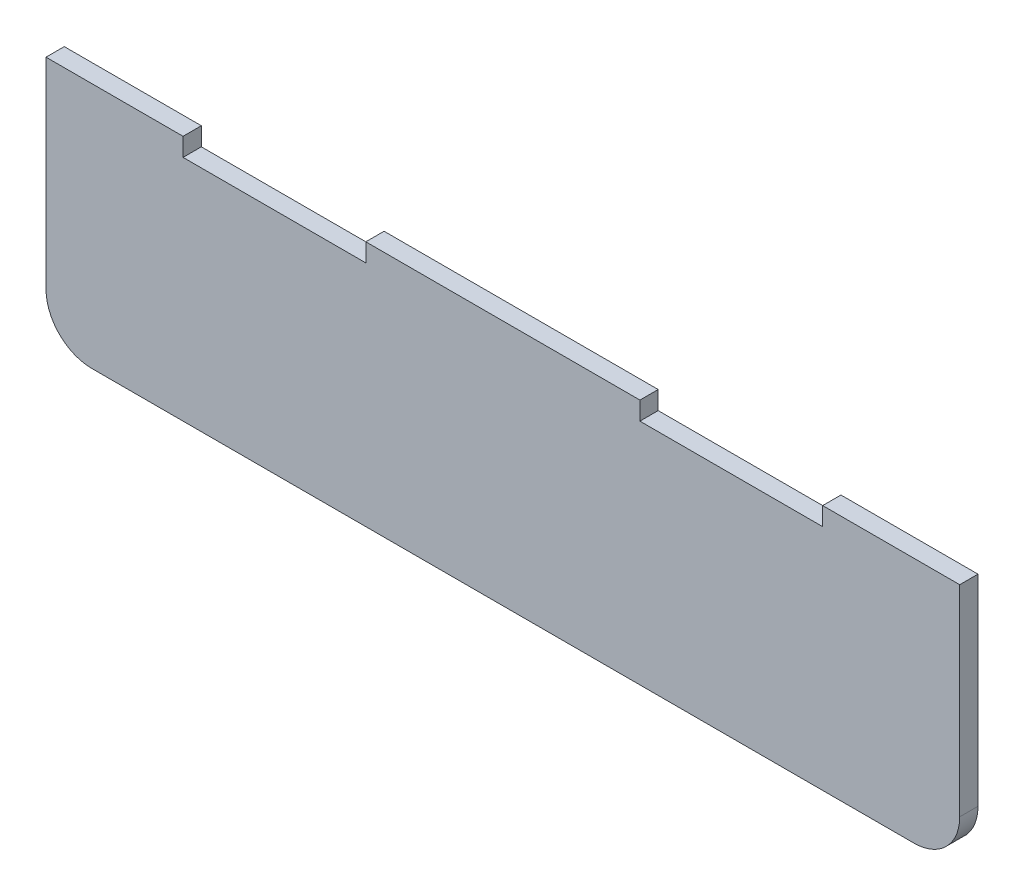
ISO-10303-21;
HEADER;
FILE_DESCRIPTION(('STEP AP214'),'2;1');
FILE_NAME('part.step','',(''),(''),'','','');
FILE_SCHEMA(('AUTOMOTIVE_DESIGN { 1 0 10303 214 1 1 1 1 }'));
ENDSEC;
DATA;
#1=APPLICATION_CONTEXT('core data for automotive mechanical design processes');
#2=APPLICATION_PROTOCOL_DEFINITION('international standard','automotive_design',2000,#1);
#3=PRODUCT_CONTEXT('',#1,'mechanical');
#4=PRODUCT('Part','Part','',(#3));
#5=PRODUCT_RELATED_PRODUCT_CATEGORY('part','',(#4));
#6=PRODUCT_DEFINITION_FORMATION('','',#4);
#7=PRODUCT_DEFINITION_CONTEXT('part definition',#1,'design');
#8=PRODUCT_DEFINITION('design','',#6,#7);
#9=PRODUCT_DEFINITION_SHAPE('','',#8);
#10=(LENGTH_UNIT() NAMED_UNIT(*) SI_UNIT(.MILLI.,.METRE.));
#11=(NAMED_UNIT(*) PLANE_ANGLE_UNIT() SI_UNIT($,.RADIAN.));
#12=(NAMED_UNIT(*) SI_UNIT($,.STERADIAN.) SOLID_ANGLE_UNIT());
#13=UNCERTAINTY_MEASURE_WITH_UNIT(LENGTH_MEASURE(1.E-05),#10,'distance_accuracy_value','');
#14=(GEOMETRIC_REPRESENTATION_CONTEXT(3) GLOBAL_UNCERTAINTY_ASSIGNED_CONTEXT((#13)) GLOBAL_UNIT_ASSIGNED_CONTEXT((#10,
#11,#12)) REPRESENTATION_CONTEXT('',''));
#15=CARTESIAN_POINT('',(0.,0.,0.));
#16=DIRECTION('',(0.,0.,1.));
#17=DIRECTION('',(1.,0.,0.));
#18=AXIS2_PLACEMENT_3D('',#15,#16,#17);
#19=CARTESIAN_POINT('',(200.,54.,4.));
#20=DIRECTION('',(0.,-1.,0.));
#21=DIRECTION('',(1.,0.,0.));
#22=AXIS2_PLACEMENT_3D('',#19,#20,#21);
#23=PLANE('',#22);
#24=DIRECTION('',(-1.,0.,0.));
#25=VECTOR('',#24,1.);
#26=CARTESIAN_POINT('',(200.,54.,0.));
#27=LINE('',#26,#25);
#28=CARTESIAN_POINT('',(200.,54.,0.));
#29=VERTEX_POINT('',#28);
#30=CARTESIAN_POINT('',(170.,54.,0.));
#31=VERTEX_POINT('',#30);
#32=EDGE_CURVE('E169',#29,#31,#27,.T.);
#33=ORIENTED_EDGE('',*,*,#32,.T.);
#34=DIRECTION('',(0.,0.,-1.));
#35=VECTOR('',#34,1.);
#36=CARTESIAN_POINT('',(170.,54.,4.));
#37=LINE('',#36,#35);
#38=CARTESIAN_POINT('',(170.,54.,4.));
#39=VERTEX_POINT('',#38);
#40=EDGE_CURVE('E41',#39,#31,#37,.T.);
#41=ORIENTED_EDGE('',*,*,#40,.F.);
#42=DIRECTION('',(-1.,0.,0.));
#43=VECTOR('',#42,1.);
#44=CARTESIAN_POINT('',(200.,54.,4.));
#45=LINE('',#44,#43);
#46=CARTESIAN_POINT('',(200.,54.,4.));
#47=VERTEX_POINT('',#46);
#48=EDGE_CURVE('E111',#47,#39,#45,.T.);
#49=ORIENTED_EDGE('',*,*,#48,.F.);
#50=DIRECTION('',(0.,0.,-1.));
#51=VECTOR('',#50,1.);
#52=CARTESIAN_POINT('',(200.,54.,4.));
#53=LINE('',#52,#51);
#54=EDGE_CURVE('E11',#47,#29,#53,.T.);
#55=ORIENTED_EDGE('',*,*,#54,.T.);
#56=EDGE_LOOP('',(#33,#41,#49,#55));
#57=FACE_BOUND('',#56,.T.);
#58=ADVANCED_FACE('F33',(#57),#23,.F.);
#59=CARTESIAN_POINT('',(170.,50.,4.));
#60=DIRECTION('',(1.,0.,0.));
#61=DIRECTION('',(0.,0.,-1.));
#62=AXIS2_PLACEMENT_3D('',#59,#60,#61);
#63=PLANE('',#62);
#64=DIRECTION('',(0.,-1.,0.));
#65=VECTOR('',#64,1.);
#66=CARTESIAN_POINT('',(170.,50.,0.));
#67=LINE('',#66,#65);
#68=CARTESIAN_POINT('',(170.,50.,0.));
#69=VERTEX_POINT('',#68);
#70=EDGE_CURVE('E171',#31,#69,#67,.T.);
#71=ORIENTED_EDGE('',*,*,#70,.T.);
#72=DIRECTION('',(0.,0.,-1.));
#73=VECTOR('',#72,1.);
#74=CARTESIAN_POINT('',(170.,50.,4.));
#75=LINE('',#74,#73);
#76=CARTESIAN_POINT('',(170.,50.,4.));
#77=VERTEX_POINT('',#76);
#78=EDGE_CURVE('E219',#77,#69,#75,.T.);
#79=ORIENTED_EDGE('',*,*,#78,.F.);
#80=DIRECTION('',(0.,-1.,0.));
#81=VECTOR('',#80,1.);
#82=CARTESIAN_POINT('',(170.,50.,4.));
#83=LINE('',#82,#81);
#84=EDGE_CURVE('E227',#39,#77,#83,.T.);
#85=ORIENTED_EDGE('',*,*,#84,.F.);
#86=ORIENTED_EDGE('',*,*,#40,.T.);
#87=EDGE_LOOP('',(#71,#79,#85,#86));
#88=FACE_BOUND('',#87,.T.);
#89=ADVANCED_FACE('F225',(#88),#63,.F.);
#90=CARTESIAN_POINT('',(130.,50.,4.));
#91=DIRECTION('',(0.,-1.,0.));
#92=DIRECTION('',(1.,0.,0.));
#93=AXIS2_PLACEMENT_3D('',#90,#91,#92);
#94=PLANE('',#93);
#95=DIRECTION('',(-1.,0.,0.));
#96=VECTOR('',#95,1.);
#97=CARTESIAN_POINT('',(130.,50.,0.));
#98=LINE('',#97,#96);
#99=CARTESIAN_POINT('',(130.,50.,0.));
#100=VERTEX_POINT('',#99);
#101=EDGE_CURVE('E173',#69,#100,#98,.T.);
#102=ORIENTED_EDGE('',*,*,#101,.T.);
#103=DIRECTION('',(0.,0.,-1.));
#104=VECTOR('',#103,1.);
#105=CARTESIAN_POINT('',(130.,50.,4.));
#106=LINE('',#105,#104);
#107=CARTESIAN_POINT('',(130.,50.,4.));
#108=VERTEX_POINT('',#107);
#109=EDGE_CURVE('E216',#108,#100,#106,.T.);
#110=ORIENTED_EDGE('',*,*,#109,.F.);
#111=DIRECTION('',(-1.,0.,0.));
#112=VECTOR('',#111,1.);
#113=CARTESIAN_POINT('',(130.,50.,4.));
#114=LINE('',#113,#112);
#115=EDGE_CURVE('E246',#77,#108,#114,.T.);
#116=ORIENTED_EDGE('',*,*,#115,.F.);
#117=ORIENTED_EDGE('',*,*,#78,.T.);
#118=EDGE_LOOP('',(#102,#110,#116,#117));
#119=FACE_BOUND('',#118,.T.);
#120=ADVANCED_FACE('F237',(#119),#94,.F.);
#121=CARTESIAN_POINT('',(130.,50.,4.));
#122=DIRECTION('',(-1.,0.,0.));
#123=DIRECTION('',(0.,0.,1.));
#124=AXIS2_PLACEMENT_3D('',#121,#122,#123);
#125=PLANE('',#124);
#126=DIRECTION('',(0.,1.,0.));
#127=VECTOR('',#126,1.);
#128=CARTESIAN_POINT('',(130.,50.,0.));
#129=LINE('',#128,#127);
#130=CARTESIAN_POINT('',(130.,54.,0.));
#131=VERTEX_POINT('',#130);
#132=EDGE_CURVE('E175',#100,#131,#129,.T.);
#133=ORIENTED_EDGE('',*,*,#132,.T.);
#134=DIRECTION('',(0.,0.,-1.));
#135=VECTOR('',#134,1.);
#136=CARTESIAN_POINT('',(130.,54.,4.));
#137=LINE('',#136,#135);
#138=CARTESIAN_POINT('',(130.,54.,4.));
#139=VERTEX_POINT('',#138);
#140=EDGE_CURVE('E213',#139,#131,#137,.T.);
#141=ORIENTED_EDGE('',*,*,#140,.F.);
#142=DIRECTION('',(0.,1.,0.));
#143=VECTOR('',#142,1.);
#144=CARTESIAN_POINT('',(130.,50.,4.));
#145=LINE('',#144,#143);
#146=EDGE_CURVE('E243',#108,#139,#145,.T.);
#147=ORIENTED_EDGE('',*,*,#146,.F.);
#148=ORIENTED_EDGE('',*,*,#109,.T.);
#149=EDGE_LOOP('',(#133,#141,#147,#148));
#150=FACE_BOUND('',#149,.T.);
#151=ADVANCED_FACE('F241',(#150),#125,.F.);
#152=CARTESIAN_POINT('',(70.,54.,4.));
#153=DIRECTION('',(0.,-1.,0.));
#154=DIRECTION('',(0.,0.,-1.));
#155=AXIS2_PLACEMENT_3D('',#152,#153,#154);
#156=PLANE('',#155);
#157=DIRECTION('',(-1.,0.,0.));
#158=VECTOR('',#157,1.);
#159=CARTESIAN_POINT('',(70.,54.,0.));
#160=LINE('',#159,#158);
#161=CARTESIAN_POINT('',(70.,54.,0.));
#162=VERTEX_POINT('',#161);
#163=EDGE_CURVE('E177',#131,#162,#160,.T.);
#164=ORIENTED_EDGE('',*,*,#163,.T.);
#165=DIRECTION('',(0.,0.,-1.));
#166=VECTOR('',#165,1.);
#167=CARTESIAN_POINT('',(70.,54.,4.));
#168=LINE('',#167,#166);
#169=CARTESIAN_POINT('',(70.,54.,4.));
#170=VERTEX_POINT('',#169);
#171=EDGE_CURVE('E210',#170,#162,#168,.T.);
#172=ORIENTED_EDGE('',*,*,#171,.F.);
#173=DIRECTION('',(-1.,0.,0.));
#174=VECTOR('',#173,1.);
#175=CARTESIAN_POINT('',(70.,54.,4.));
#176=LINE('',#175,#174);
#177=EDGE_CURVE('E245',#139,#170,#176,.T.);
#178=ORIENTED_EDGE('',*,*,#177,.F.);
#179=ORIENTED_EDGE('',*,*,#140,.T.);
#180=EDGE_LOOP('',(#164,#172,#178,#179));
#181=FACE_BOUND('',#180,.T.);
#182=ADVANCED_FACE('F291',(#181),#156,.F.);
#183=CARTESIAN_POINT('',(70.,50.,4.));
#184=DIRECTION('',(1.,0.,0.));
#185=DIRECTION('',(0.,0.,-1.));
#186=AXIS2_PLACEMENT_3D('',#183,#184,#185);
#187=PLANE('',#186);
#188=DIRECTION('',(0.,-1.,0.));
#189=VECTOR('',#188,1.);
#190=CARTESIAN_POINT('',(70.,50.,0.));
#191=LINE('',#190,#189);
#192=CARTESIAN_POINT('',(70.,50.,0.));
#193=VERTEX_POINT('',#192);
#194=EDGE_CURVE('E179',#162,#193,#191,.T.);
#195=ORIENTED_EDGE('',*,*,#194,.T.);
#196=DIRECTION('',(0.,0.,-1.));
#197=VECTOR('',#196,1.);
#198=CARTESIAN_POINT('',(70.,50.,4.));
#199=LINE('',#198,#197);
#200=CARTESIAN_POINT('',(70.,50.,4.));
#201=VERTEX_POINT('',#200);
#202=EDGE_CURVE('E207',#201,#193,#199,.T.);
#203=ORIENTED_EDGE('',*,*,#202,.F.);
#204=DIRECTION('',(0.,-1.,0.));
#205=VECTOR('',#204,1.);
#206=CARTESIAN_POINT('',(70.,50.,4.));
#207=LINE('',#206,#205);
#208=EDGE_CURVE('E248',#170,#201,#207,.T.);
#209=ORIENTED_EDGE('',*,*,#208,.F.);
#210=ORIENTED_EDGE('',*,*,#171,.T.);
#211=EDGE_LOOP('',(#195,#203,#209,#210));
#212=FACE_BOUND('',#211,.T.);
#213=ADVANCED_FACE('F294',(#212),#187,.F.);
#214=CARTESIAN_POINT('',(30.,50.,4.));
#215=DIRECTION('',(0.,-1.,0.));
#216=DIRECTION('',(0.,0.,-1.));
#217=AXIS2_PLACEMENT_3D('',#214,#215,#216);
#218=PLANE('',#217);
#219=DIRECTION('',(-1.,0.,0.));
#220=VECTOR('',#219,1.);
#221=CARTESIAN_POINT('',(30.,50.,0.));
#222=LINE('',#221,#220);
#223=CARTESIAN_POINT('',(30.,50.,0.));
#224=VERTEX_POINT('',#223);
#225=EDGE_CURVE('E181',#193,#224,#222,.T.);
#226=ORIENTED_EDGE('',*,*,#225,.T.);
#227=DIRECTION('',(0.,0.,-1.));
#228=VECTOR('',#227,1.);
#229=CARTESIAN_POINT('',(30.,50.,4.));
#230=LINE('',#229,#228);
#231=CARTESIAN_POINT('',(30.,50.,4.));
#232=VERTEX_POINT('',#231);
#233=EDGE_CURVE('E204',#232,#224,#230,.T.);
#234=ORIENTED_EDGE('',*,*,#233,.F.);
#235=DIRECTION('',(-1.,0.,0.));
#236=VECTOR('',#235,1.);
#237=CARTESIAN_POINT('',(30.,50.,4.));
#238=LINE('',#237,#236);
#239=EDGE_CURVE('E254',#201,#232,#238,.T.);
#240=ORIENTED_EDGE('',*,*,#239,.F.);
#241=ORIENTED_EDGE('',*,*,#202,.T.);
#242=EDGE_LOOP('',(#226,#234,#240,#241));
#243=FACE_BOUND('',#242,.T.);
#244=ADVANCED_FACE('F298',(#243),#218,.F.);
#245=CARTESIAN_POINT('',(30.,50.,4.));
#246=DIRECTION('',(-1.,0.,0.));
#247=DIRECTION('',(0.,0.,1.));
#248=AXIS2_PLACEMENT_3D('',#245,#246,#247);
#249=PLANE('',#248);
#250=DIRECTION('',(0.,1.,0.));
#251=VECTOR('',#250,1.);
#252=CARTESIAN_POINT('',(30.,50.,0.));
#253=LINE('',#252,#251);
#254=CARTESIAN_POINT('',(30.,54.,0.));
#255=VERTEX_POINT('',#254);
#256=EDGE_CURVE('E183',#224,#255,#253,.T.);
#257=ORIENTED_EDGE('',*,*,#256,.T.);
#258=DIRECTION('',(0.,0.,-1.));
#259=VECTOR('',#258,1.);
#260=CARTESIAN_POINT('',(30.,54.,4.));
#261=LINE('',#260,#259);
#262=CARTESIAN_POINT('',(30.,54.,4.));
#263=VERTEX_POINT('',#262);
#264=EDGE_CURVE('E201',#263,#255,#261,.T.);
#265=ORIENTED_EDGE('',*,*,#264,.F.);
#266=DIRECTION('',(0.,1.,0.));
#267=VECTOR('',#266,1.);
#268=CARTESIAN_POINT('',(30.,50.,4.));
#269=LINE('',#268,#267);
#270=EDGE_CURVE('E256',#232,#263,#269,.T.);
#271=ORIENTED_EDGE('',*,*,#270,.F.);
#272=ORIENTED_EDGE('',*,*,#233,.T.);
#273=EDGE_LOOP('',(#257,#265,#271,#272));
#274=FACE_BOUND('',#273,.T.);
#275=ADVANCED_FACE('F302',(#274),#249,.F.);
#276=CARTESIAN_POINT('',(0.,54.,4.));
#277=DIRECTION('',(0.,-1.,0.));
#278=DIRECTION('',(0.,0.,-1.));
#279=AXIS2_PLACEMENT_3D('',#276,#277,#278);
#280=PLANE('',#279);
#281=DIRECTION('',(-1.,0.,0.));
#282=VECTOR('',#281,1.);
#283=CARTESIAN_POINT('',(0.,54.,0.));
#284=LINE('',#283,#282);
#285=CARTESIAN_POINT('',(0.,54.,0.));
#286=VERTEX_POINT('',#285);
#287=EDGE_CURVE('E185',#255,#286,#284,.T.);
#288=ORIENTED_EDGE('',*,*,#287,.T.);
#289=DIRECTION('',(0.,0.,-1.));
#290=VECTOR('',#289,1.);
#291=CARTESIAN_POINT('',(0.,54.,4.));
#292=LINE('',#291,#290);
#293=CARTESIAN_POINT('',(0.,54.,4.));
#294=VERTEX_POINT('',#293);
#295=EDGE_CURVE('E198',#294,#286,#292,.T.);
#296=ORIENTED_EDGE('',*,*,#295,.F.);
#297=DIRECTION('',(-1.,0.,0.));
#298=VECTOR('',#297,1.);
#299=CARTESIAN_POINT('',(0.,54.,4.));
#300=LINE('',#299,#298);
#301=EDGE_CURVE('E258',#263,#294,#300,.T.);
#302=ORIENTED_EDGE('',*,*,#301,.F.);
#303=ORIENTED_EDGE('',*,*,#264,.T.);
#304=EDGE_LOOP('',(#288,#296,#302,#303));
#305=FACE_BOUND('',#304,.T.);
#306=ADVANCED_FACE('F264',(#305),#280,.F.);
#307=CARTESIAN_POINT('',(0.,10.0000000000001,4.));
#308=DIRECTION('',(1.,0.,0.));
#309=DIRECTION('',(0.,0.,-1.));
#310=AXIS2_PLACEMENT_3D('',#307,#308,#309);
#311=PLANE('',#310);
#312=DIRECTION('',(0.,-1.,0.));
#313=VECTOR('',#312,1.);
#314=CARTESIAN_POINT('',(0.,10.0000000000001,0.));
#315=LINE('',#314,#313);
#316=CARTESIAN_POINT('',(0.,10.,0.));
#317=VERTEX_POINT('',#316);
#318=EDGE_CURVE('E188',#286,#317,#315,.T.);
#319=ORIENTED_EDGE('',*,*,#318,.T.);
#320=DIRECTION('',(0.,0.,-1.));
#321=VECTOR('',#320,1.);
#322=CARTESIAN_POINT('',(0.,10.,4.));
#323=LINE('',#322,#321);
#324=CARTESIAN_POINT('',(0.,10.,4.));
#325=VERTEX_POINT('',#324);
#326=EDGE_CURVE('E158',#325,#317,#323,.T.);
#327=ORIENTED_EDGE('',*,*,#326,.F.);
#328=DIRECTION('',(0.,-1.,0.));
#329=VECTOR('',#328,1.);
#330=CARTESIAN_POINT('',(0.,50.,4.));
#331=LINE('',#330,#329);
#332=EDGE_CURVE('E149',#294,#325,#331,.T.);
#333=ORIENTED_EDGE('',*,*,#332,.F.);
#334=ORIENTED_EDGE('',*,*,#295,.T.);
#335=EDGE_LOOP('',(#319,#327,#333,#334));
#336=FACE_BOUND('',#335,.T.);
#337=ADVANCED_FACE('F267',(#336),#311,.F.);
#338=CARTESIAN_POINT('',(10.,10.,4.));
#339=DIRECTION('',(0.,0.,-1.));
#340=DIRECTION('',(-1.,0.,0.));
#341=AXIS2_PLACEMENT_3D('',#338,#339,#340);
#342=CYLINDRICAL_SURFACE('',#341,10.);
#343=CARTESIAN_POINT('',(10.,10.,0.));
#344=DIRECTION('',(0.,0.,1.));
#345=DIRECTION('',(-1.,0.,0.));
#346=AXIS2_PLACEMENT_3D('',#343,#344,#345);
#347=CIRCLE('',#346,10.);
#348=CARTESIAN_POINT('',(10.0000000000001,0.,0.));
#349=VERTEX_POINT('',#348);
#350=EDGE_CURVE('E157',#317,#349,#347,.T.);
#351=ORIENTED_EDGE('',*,*,#350,.T.);
#352=DIRECTION('',(0.,0.,-1.));
#353=VECTOR('',#352,1.);
#354=CARTESIAN_POINT('',(10.0000000000001,0.,4.));
#355=LINE('',#354,#353);
#356=CARTESIAN_POINT('',(10.0000000000001,0.,4.));
#357=VERTEX_POINT('',#356);
#358=EDGE_CURVE('E154',#357,#349,#355,.T.);
#359=ORIENTED_EDGE('',*,*,#358,.F.);
#360=CARTESIAN_POINT('',(10.,10.,4.));
#361=DIRECTION('',(0.,0.,1.));
#362=DIRECTION('',(-1.,0.,0.));
#363=AXIS2_PLACEMENT_3D('',#360,#361,#362);
#364=CIRCLE('',#363,10.);
#365=EDGE_CURVE('E143',#325,#357,#364,.T.);
#366=ORIENTED_EDGE('',*,*,#365,.F.);
#367=ORIENTED_EDGE('',*,*,#326,.T.);
#368=EDGE_LOOP('',(#351,#359,#366,#367));
#369=FACE_BOUND('',#368,.T.);
#370=ADVANCED_FACE('F155',(#369),#342,.T.);
#371=CARTESIAN_POINT('',(10.0000000000001,0.,4.));
#372=DIRECTION('',(0.,1.,0.));
#373=DIRECTION('',(0.,0.,1.));
#374=AXIS2_PLACEMENT_3D('',#371,#372,#373);
#375=PLANE('',#374);
#376=DIRECTION('',(1.,0.,0.));
#377=VECTOR('',#376,1.);
#378=CARTESIAN_POINT('',(10.0000000000001,0.,0.));
#379=LINE('',#378,#377);
#380=CARTESIAN_POINT('',(190.,0.,0.));
#381=VERTEX_POINT('',#380);
#382=EDGE_CURVE('E97',#349,#381,#379,.T.);
#383=ORIENTED_EDGE('',*,*,#382,.T.);
#384=DIRECTION('',(0.,0.,-1.));
#385=VECTOR('',#384,1.);
#386=CARTESIAN_POINT('',(190.,0.,4.));
#387=LINE('',#386,#385);
#388=CARTESIAN_POINT('',(190.,0.,4.));
#389=VERTEX_POINT('',#388);
#390=EDGE_CURVE('E159',#389,#381,#387,.T.);
#391=ORIENTED_EDGE('',*,*,#390,.F.);
#392=DIRECTION('',(1.,0.,0.));
#393=VECTOR('',#392,1.);
#394=CARTESIAN_POINT('',(10.0000000000001,0.,4.));
#395=LINE('',#394,#393);
#396=EDGE_CURVE('E147',#357,#389,#395,.T.);
#397=ORIENTED_EDGE('',*,*,#396,.F.);
#398=ORIENTED_EDGE('',*,*,#358,.T.);
#399=EDGE_LOOP('',(#383,#391,#397,#398));
#400=FACE_BOUND('',#399,.T.);
#401=ADVANCED_FACE('F161',(#400),#375,.F.);
#402=CARTESIAN_POINT('',(190.,10.,4.));
#403=DIRECTION('',(0.,0.,-1.));
#404=DIRECTION('',(-1.,0.,0.));
#405=AXIS2_PLACEMENT_3D('',#402,#403,#404);
#406=CYLINDRICAL_SURFACE('',#405,10.);
#407=CARTESIAN_POINT('',(190.,10.,0.));
#408=DIRECTION('',(0.,0.,1.));
#409=DIRECTION('',(1.,0.,0.));
#410=AXIS2_PLACEMENT_3D('',#407,#408,#409);
#411=CIRCLE('',#410,10.);
#412=CARTESIAN_POINT('',(200.,10.0000000000001,0.));
#413=VERTEX_POINT('',#412);
#414=EDGE_CURVE('E104',#381,#413,#411,.T.);
#415=ORIENTED_EDGE('',*,*,#414,.T.);
#416=DIRECTION('',(0.,0.,-1.));
#417=VECTOR('',#416,1.);
#418=CARTESIAN_POINT('',(200.,10.0000000000001,4.));
#419=LINE('',#418,#417);
#420=CARTESIAN_POINT('',(200.,10.0000000000001,4.));
#421=VERTEX_POINT('',#420);
#422=EDGE_CURVE('E165',#421,#413,#419,.T.);
#423=ORIENTED_EDGE('',*,*,#422,.F.);
#424=CARTESIAN_POINT('',(190.,10.,4.));
#425=DIRECTION('',(0.,0.,1.));
#426=DIRECTION('',(1.,0.,0.));
#427=AXIS2_PLACEMENT_3D('',#424,#425,#426);
#428=CIRCLE('',#427,10.);
#429=EDGE_CURVE('E163',#389,#421,#428,.T.);
#430=ORIENTED_EDGE('',*,*,#429,.F.);
#431=ORIENTED_EDGE('',*,*,#390,.T.);
#432=EDGE_LOOP('',(#415,#423,#430,#431));
#433=FACE_BOUND('',#432,.T.);
#434=ADVANCED_FACE('F269',(#433),#406,.T.);
#435=CARTESIAN_POINT('',(200.,10.0000000000001,4.));
#436=DIRECTION('',(-1.,0.,0.));
#437=DIRECTION('',(0.,0.,1.));
#438=AXIS2_PLACEMENT_3D('',#435,#436,#437);
#439=PLANE('',#438);
#440=DIRECTION('',(0.,1.,0.));
#441=VECTOR('',#440,1.);
#442=CARTESIAN_POINT('',(200.,10.0000000000001,0.));
#443=LINE('',#442,#441);
#444=EDGE_CURVE('E193',#413,#29,#443,.T.);
#445=ORIENTED_EDGE('',*,*,#444,.T.);
#446=ORIENTED_EDGE('',*,*,#54,.F.);
#447=DIRECTION('',(0.,1.,0.));
#448=VECTOR('',#447,1.);
#449=CARTESIAN_POINT('',(200.,50.,4.));
#450=LINE('',#449,#448);
#451=EDGE_CURVE('E49',#421,#47,#450,.T.);
#452=ORIENTED_EDGE('',*,*,#451,.F.);
#453=ORIENTED_EDGE('',*,*,#422,.T.);
#454=EDGE_LOOP('',(#445,#446,#452,#453));
#455=FACE_BOUND('',#454,.T.);
#456=ADVANCED_FACE('F268',(#455),#439,.F.);
#457=CARTESIAN_POINT('',(10.,10.,4.));
#458=DIRECTION('',(0.,0.,-1.));
#459=DIRECTION('',(-1.,0.,0.));
#460=AXIS2_PLACEMENT_3D('',#457,#458,#459);
#461=PLANE('',#460);
#462=ORIENTED_EDGE('',*,*,#451,.T.);
#463=ORIENTED_EDGE('',*,*,#48,.T.);
#464=ORIENTED_EDGE('',*,*,#84,.T.);
#465=ORIENTED_EDGE('',*,*,#115,.T.);
#466=ORIENTED_EDGE('',*,*,#146,.T.);
#467=ORIENTED_EDGE('',*,*,#177,.T.);
#468=ORIENTED_EDGE('',*,*,#208,.T.);
#469=ORIENTED_EDGE('',*,*,#239,.T.);
#470=ORIENTED_EDGE('',*,*,#270,.T.);
#471=ORIENTED_EDGE('',*,*,#301,.T.);
#472=ORIENTED_EDGE('',*,*,#332,.T.);
#473=ORIENTED_EDGE('',*,*,#365,.T.);
#474=ORIENTED_EDGE('',*,*,#396,.T.);
#475=ORIENTED_EDGE('',*,*,#429,.T.);
#476=EDGE_LOOP('',(#462,#463,#464,#465,#466,#467,#468,#469,#470,#471,#472,#473,#474,#475));
#477=FACE_BOUND('',#476,.T.);
#478=ADVANCED_FACE('F145',(#477),#461,.F.);
#479=CARTESIAN_POINT('',(10.,10.,0.));
#480=DIRECTION('',(0.,0.,-1.));
#481=DIRECTION('',(-1.,0.,0.));
#482=AXIS2_PLACEMENT_3D('',#479,#480,#481);
#483=PLANE('',#482);
#484=ORIENTED_EDGE('',*,*,#32,.F.);
#485=ORIENTED_EDGE('',*,*,#444,.F.);
#486=ORIENTED_EDGE('',*,*,#414,.F.);
#487=ORIENTED_EDGE('',*,*,#382,.F.);
#488=ORIENTED_EDGE('',*,*,#350,.F.);
#489=ORIENTED_EDGE('',*,*,#318,.F.);
#490=ORIENTED_EDGE('',*,*,#287,.F.);
#491=ORIENTED_EDGE('',*,*,#256,.F.);
#492=ORIENTED_EDGE('',*,*,#225,.F.);
#493=ORIENTED_EDGE('',*,*,#194,.F.);
#494=ORIENTED_EDGE('',*,*,#163,.F.);
#495=ORIENTED_EDGE('',*,*,#132,.F.);
#496=ORIENTED_EDGE('',*,*,#101,.F.);
#497=ORIENTED_EDGE('',*,*,#70,.F.);
#498=EDGE_LOOP('',(#484,#485,#486,#487,#488,#489,#490,#491,#492,#493,#494,#495,#496,#497));
#499=FACE_BOUND('',#498,.T.);
#500=ADVANCED_FACE('F231',(#499),#483,.T.);
#501=CLOSED_SHELL('',(#58,#89,#120,#151,#182,#213,#244,#275,#306,#337,#370,#401,#434,#456,#478,#500));
#502=MANIFOLD_SOLID_BREP('B2',#501);
#503=ADVANCED_BREP_SHAPE_REPRESENTATION('',(#18,#502),#14);
#504=SHAPE_DEFINITION_REPRESENTATION(#9,#503);
ENDSEC;
END-ISO-10303-21;
